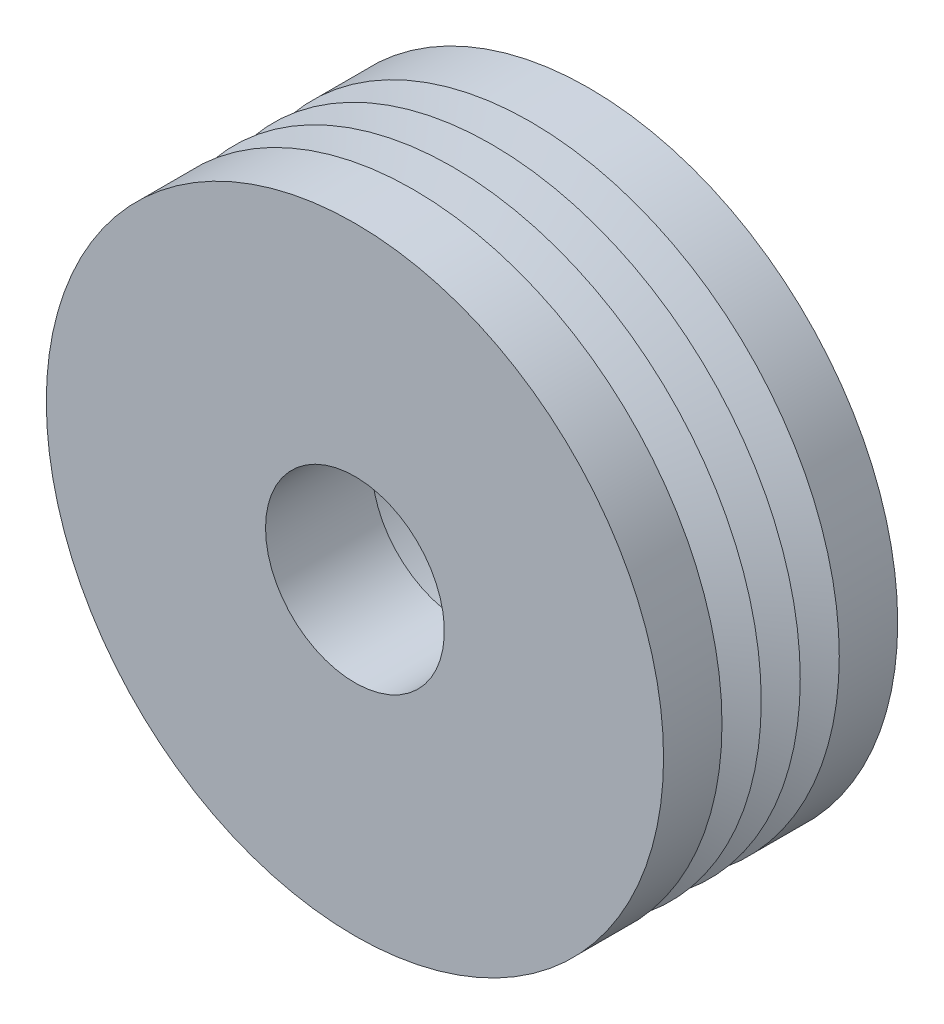
ISO-10303-21;
HEADER;
FILE_DESCRIPTION(('STEP AP214'),'2;1');
FILE_NAME('part.step','',(''),(''),'','','');
FILE_SCHEMA(('AUTOMOTIVE_DESIGN { 1 0 10303 214 1 1 1 1 }'));
ENDSEC;
DATA;
#1=APPLICATION_CONTEXT('core data for automotive mechanical design processes');
#2=APPLICATION_PROTOCOL_DEFINITION('international standard','automotive_design',2000,#1);
#3=PRODUCT_CONTEXT('',#1,'mechanical');
#4=PRODUCT('Part','Part','',(#3));
#5=PRODUCT_RELATED_PRODUCT_CATEGORY('part','',(#4));
#6=PRODUCT_DEFINITION_FORMATION('','',#4);
#7=PRODUCT_DEFINITION_CONTEXT('part definition',#1,'design');
#8=PRODUCT_DEFINITION('design','',#6,#7);
#9=PRODUCT_DEFINITION_SHAPE('','',#8);
#10=(LENGTH_UNIT() NAMED_UNIT(*) SI_UNIT(.MILLI.,.METRE.));
#11=(NAMED_UNIT(*) PLANE_ANGLE_UNIT() SI_UNIT($,.RADIAN.));
#12=(NAMED_UNIT(*) SI_UNIT($,.STERADIAN.) SOLID_ANGLE_UNIT());
#13=UNCERTAINTY_MEASURE_WITH_UNIT(LENGTH_MEASURE(1.E-05),#10,'distance_accuracy_value','');
#14=(GEOMETRIC_REPRESENTATION_CONTEXT(3) GLOBAL_UNCERTAINTY_ASSIGNED_CONTEXT((#13)) GLOBAL_UNIT_ASSIGNED_CONTEXT((#10,
#11,#12)) REPRESENTATION_CONTEXT('',''));
#15=CARTESIAN_POINT('',(0.,0.,0.));
#16=DIRECTION('',(0.,0.,1.));
#17=DIRECTION('',(1.,0.,0.));
#18=AXIS2_PLACEMENT_3D('',#15,#16,#17);
#19=CARTESIAN_POINT('',(0.,0.,-5.5));
#20=DIRECTION('',(0.,0.,-1.));
#21=DIRECTION('',(-1.,0.,0.));
#22=AXIS2_PLACEMENT_3D('',#19,#20,#21);
#23=PLANE('',#22);
#24=CARTESIAN_POINT('',(0.,0.,-5.5));
#25=DIRECTION('',(0.,0.,-1.));
#26=DIRECTION('',(-1.,0.,0.));
#27=AXIS2_PLACEMENT_3D('',#24,#25,#26);
#28=CIRCLE('',#27,4.5);
#29=CARTESIAN_POINT('',(-4.5,0.,-5.5));
#30=VERTEX_POINT('',#29);
#31=EDGE_CURVE('E70',#30,#30,#28,.T.);
#32=ORIENTED_EDGE('',*,*,#31,.F.);
#33=EDGE_LOOP('',(#32));
#34=FACE_BOUND('',#33,.T.);
#35=CARTESIAN_POINT('',(0.,0.,-5.5));
#36=DIRECTION('',(0.,0.,-1.));
#37=DIRECTION('',(-1.,0.,0.));
#38=AXIS2_PLACEMENT_3D('',#35,#36,#37);
#39=CIRCLE('',#38,7.25);
#40=CARTESIAN_POINT('',(-7.25,0.,-5.5));
#41=VERTEX_POINT('',#40);
#42=EDGE_CURVE('E10',#41,#41,#39,.T.);
#43=ORIENTED_EDGE('',*,*,#42,.T.);
#44=EDGE_LOOP('',(#43));
#45=FACE_BOUND('',#44,.T.);
#46=ADVANCED_FACE('F35',(#34,#45),#23,.T.);
#47=CARTESIAN_POINT('',(0.,0.,-5.5));
#48=DIRECTION('',(0.,0.,-1.));
#49=DIRECTION('',(-1.,0.,0.));
#50=AXIS2_PLACEMENT_3D('',#47,#48,#49);
#51=CYLINDRICAL_SURFACE('',#50,7.25);
#52=CARTESIAN_POINT('',(0.,0.,-4.12762455574936));
#53=DIRECTION('',(0.,0.,-1.));
#54=DIRECTION('',(-1.,0.,0.));
#55=AXIS2_PLACEMENT_3D('',#52,#53,#54);
#56=CIRCLE('',#55,7.25);
#57=CARTESIAN_POINT('',(-7.25,0.,-4.12762455574936));
#58=VERTEX_POINT('',#57);
#59=EDGE_CURVE('E41',#58,#58,#56,.T.);
#60=ORIENTED_EDGE('',*,*,#59,.T.);
#61=EDGE_LOOP('',(#60));
#62=FACE_BOUND('',#61,.T.);
#63=ORIENTED_EDGE('',*,*,#42,.F.);
#64=EDGE_LOOP('',(#63));
#65=FACE_BOUND('',#64,.T.);
#66=ADVANCED_FACE('F104',(#62,#65),#51,.T.);
#67=CARTESIAN_POINT('',(0.,0.,-4.12762455574936));
#68=DIRECTION('',(0.,0.,-1.));
#69=DIRECTION('',(-1.,0.,0.));
#70=AXIS2_PLACEMENT_3D('',#67,#68,#69);
#71=CONICAL_SURFACE('',#70,7.25,1.13886727520669);
#72=CARTESIAN_POINT('',(0.,0.,-3.66666666666667));
#73=DIRECTION('',(0.,0.,-1.));
#74=DIRECTION('',(-1.,0.,0.));
#75=AXIS2_PLACEMENT_3D('',#72,#73,#74);
#76=CIRCLE('',#75,6.25);
#77=CARTESIAN_POINT('',(-6.25,0.,-3.66666666666667));
#78=VERTEX_POINT('',#77);
#79=EDGE_CURVE('E45',#78,#78,#76,.T.);
#80=ORIENTED_EDGE('',*,*,#79,.T.);
#81=EDGE_LOOP('',(#80));
#82=FACE_BOUND('',#81,.T.);
#83=ORIENTED_EDGE('',*,*,#59,.F.);
#84=EDGE_LOOP('',(#83));
#85=FACE_BOUND('',#84,.T.);
#86=ADVANCED_FACE('F108',(#82,#85),#71,.T.);
#87=CARTESIAN_POINT('',(0.,0.,-3.66666666666667));
#88=DIRECTION('',(0.,0.,1.));
#89=DIRECTION('',(1.,0.,0.));
#90=AXIS2_PLACEMENT_3D('',#87,#88,#89);
#91=CONICAL_SURFACE('',#90,6.25,1.14320513240904);
#92=CARTESIAN_POINT('',(0.,0.,-3.21095788908269));
#93=DIRECTION('',(0.,0.,-1.));
#94=DIRECTION('',(-1.,0.,0.));
#95=AXIS2_PLACEMENT_3D('',#92,#93,#94);
#96=CIRCLE('',#95,7.25);
#97=CARTESIAN_POINT('',(-7.25,0.,-3.21095788908269));
#98=VERTEX_POINT('',#97);
#99=EDGE_CURVE('E49',#98,#98,#96,.T.);
#100=ORIENTED_EDGE('',*,*,#99,.T.);
#101=EDGE_LOOP('',(#100));
#102=FACE_BOUND('',#101,.T.);
#103=ORIENTED_EDGE('',*,*,#79,.F.);
#104=EDGE_LOOP('',(#103));
#105=FACE_BOUND('',#104,.T.);
#106=ADVANCED_FACE('F112',(#102,#105),#91,.T.);
#107=CARTESIAN_POINT('',(0.,0.,-3.21095788908269));
#108=DIRECTION('',(0.,0.,-1.));
#109=DIRECTION('',(-1.,0.,0.));
#110=AXIS2_PLACEMENT_3D('',#107,#108,#109);
#111=CONICAL_SURFACE('',#110,7.25,1.14320513240904);
#112=CARTESIAN_POINT('',(0.,0.,-2.75524911149872));
#113=DIRECTION('',(0.,0.,-1.));
#114=DIRECTION('',(-1.,0.,0.));
#115=AXIS2_PLACEMENT_3D('',#112,#113,#114);
#116=CIRCLE('',#115,6.25);
#117=CARTESIAN_POINT('',(-6.25,0.,-2.75524911149872));
#118=VERTEX_POINT('',#117);
#119=EDGE_CURVE('E54',#118,#118,#116,.T.);
#120=ORIENTED_EDGE('',*,*,#119,.T.);
#121=EDGE_LOOP('',(#120));
#122=FACE_BOUND('',#121,.T.);
#123=ORIENTED_EDGE('',*,*,#99,.F.);
#124=EDGE_LOOP('',(#123));
#125=FACE_BOUND('',#124,.T.);
#126=ADVANCED_FACE('F119',(#122,#125),#111,.T.);
#127=CARTESIAN_POINT('',(0.,0.,-2.75524911149872));
#128=DIRECTION('',(0.,0.,1.));
#129=DIRECTION('',(1.,0.,0.));
#130=AXIS2_PLACEMENT_3D('',#127,#128,#129);
#131=CONICAL_SURFACE('',#130,6.25,1.13886727520669);
#132=CARTESIAN_POINT('',(0.,0.,-2.29429122241603));
#133=DIRECTION('',(0.,0.,-1.));
#134=DIRECTION('',(-1.,0.,0.));
#135=AXIS2_PLACEMENT_3D('',#132,#133,#134);
#136=CIRCLE('',#135,7.25);
#137=CARTESIAN_POINT('',(-7.25,0.,-2.29429122241603));
#138=VERTEX_POINT('',#137);
#139=EDGE_CURVE('E57',#138,#138,#136,.T.);
#140=ORIENTED_EDGE('',*,*,#139,.T.);
#141=EDGE_LOOP('',(#140));
#142=FACE_BOUND('',#141,.T.);
#143=ORIENTED_EDGE('',*,*,#119,.F.);
#144=EDGE_LOOP('',(#143));
#145=FACE_BOUND('',#144,.T.);
#146=ADVANCED_FACE('F123',(#142,#145),#131,.T.);
#147=CARTESIAN_POINT('',(0.,0.,-2.29429122241603));
#148=DIRECTION('',(0.,0.,-1.));
#149=DIRECTION('',(-1.,0.,0.));
#150=AXIS2_PLACEMENT_3D('',#147,#148,#149);
#151=CONICAL_SURFACE('',#150,7.25,1.13886727520669);
#152=CARTESIAN_POINT('',(0.,0.,-1.83333333333333));
#153=DIRECTION('',(0.,0.,-1.));
#154=DIRECTION('',(-1.,0.,0.));
#155=AXIS2_PLACEMENT_3D('',#152,#153,#154);
#156=CIRCLE('',#155,6.25);
#157=CARTESIAN_POINT('',(-6.25,0.,-1.83333333333333));
#158=VERTEX_POINT('',#157);
#159=EDGE_CURVE('E60',#158,#158,#156,.T.);
#160=ORIENTED_EDGE('',*,*,#159,.T.);
#161=EDGE_LOOP('',(#160));
#162=FACE_BOUND('',#161,.T.);
#163=ORIENTED_EDGE('',*,*,#139,.F.);
#164=EDGE_LOOP('',(#163));
#165=FACE_BOUND('',#164,.T.);
#166=ADVANCED_FACE('F127',(#162,#165),#151,.T.);
#167=CARTESIAN_POINT('',(0.,0.,-1.83333333333333));
#168=DIRECTION('',(0.,0.,1.));
#169=DIRECTION('',(1.,0.,0.));
#170=AXIS2_PLACEMENT_3D('',#167,#168,#169);
#171=CONICAL_SURFACE('',#170,6.25,1.13886727520669);
#172=CARTESIAN_POINT('',(0.,0.,-1.37237544425064));
#173=DIRECTION('',(0.,0.,-1.));
#174=DIRECTION('',(-1.,0.,0.));
#175=AXIS2_PLACEMENT_3D('',#172,#173,#174);
#176=CIRCLE('',#175,7.25);
#177=CARTESIAN_POINT('',(-7.25,0.,-1.37237544425064));
#178=VERTEX_POINT('',#177);
#179=EDGE_CURVE('E63',#178,#178,#176,.T.);
#180=ORIENTED_EDGE('',*,*,#179,.T.);
#181=EDGE_LOOP('',(#180));
#182=FACE_BOUND('',#181,.T.);
#183=ORIENTED_EDGE('',*,*,#159,.F.);
#184=EDGE_LOOP('',(#183));
#185=FACE_BOUND('',#184,.T.);
#186=ADVANCED_FACE('F131',(#182,#185),#171,.T.);
#187=CARTESIAN_POINT('',(0.,0.,-5.5));
#188=DIRECTION('',(0.,0.,-1.));
#189=DIRECTION('',(-1.,0.,0.));
#190=AXIS2_PLACEMENT_3D('',#187,#188,#189);
#191=CYLINDRICAL_SURFACE('',#190,7.25000000001131);
#192=CARTESIAN_POINT('',(0.,0.,0.));
#193=DIRECTION('',(0.,0.,-1.));
#194=DIRECTION('',(-1.,0.,0.));
#195=AXIS2_PLACEMENT_3D('',#192,#193,#194);
#196=CIRCLE('',#195,7.25000000002263);
#197=CARTESIAN_POINT('',(-7.25000000002263,0.,0.));
#198=VERTEX_POINT('',#197);
#199=EDGE_CURVE('E66',#198,#198,#196,.T.);
#200=ORIENTED_EDGE('',*,*,#199,.T.);
#201=EDGE_LOOP('',(#200));
#202=FACE_BOUND('',#201,.T.);
#203=ORIENTED_EDGE('',*,*,#179,.F.);
#204=EDGE_LOOP('',(#203));
#205=FACE_BOUND('',#204,.T.);
#206=ADVANCED_FACE('F135',(#202,#205),#191,.T.);
#207=CARTESIAN_POINT('',(-7.25000000002263,0.,0.));
#208=DIRECTION('',(0.,0.,1.));
#209=DIRECTION('',(1.,0.,0.));
#210=AXIS2_PLACEMENT_3D('',#207,#208,#209);
#211=PLANE('',#210);
#212=CARTESIAN_POINT('',(0.,0.,0.));
#213=DIRECTION('',(0.,0.,-1.));
#214=DIRECTION('',(-1.,0.,0.));
#215=AXIS2_PLACEMENT_3D('',#212,#213,#214);
#216=CIRCLE('',#215,2.1);
#217=CARTESIAN_POINT('',(-2.1,0.,0.));
#218=VERTEX_POINT('',#217);
#219=EDGE_CURVE('E73',#218,#218,#216,.T.);
#220=ORIENTED_EDGE('',*,*,#219,.T.);
#221=EDGE_LOOP('',(#220));
#222=FACE_BOUND('',#221,.T.);
#223=ORIENTED_EDGE('',*,*,#199,.F.);
#224=EDGE_LOOP('',(#223));
#225=FACE_BOUND('',#224,.T.);
#226=ADVANCED_FACE('F82',(#222,#225),#211,.T.);
#227=CARTESIAN_POINT('',(0.,0.,-2.5));
#228=DIRECTION('',(0.,0.,-1.));
#229=DIRECTION('',(-1.,0.,0.));
#230=AXIS2_PLACEMENT_3D('',#227,#228,#229);
#231=CYLINDRICAL_SURFACE('',#230,4.5);
#232=CARTESIAN_POINT('',(0.,0.,-2.5));
#233=DIRECTION('',(0.,0.,-1.));
#234=DIRECTION('',(-1.,0.,0.));
#235=AXIS2_PLACEMENT_3D('',#232,#233,#234);
#236=CIRCLE('',#235,4.5);
#237=CARTESIAN_POINT('',(-4.5,0.,-2.5));
#238=VERTEX_POINT('',#237);
#239=EDGE_CURVE('E69',#238,#238,#236,.T.);
#240=ORIENTED_EDGE('',*,*,#239,.F.);
#241=EDGE_LOOP('',(#240));
#242=FACE_BOUND('',#241,.T.);
#243=ORIENTED_EDGE('',*,*,#31,.T.);
#244=EDGE_LOOP('',(#243));
#245=FACE_BOUND('',#244,.T.);
#246=ADVANCED_FACE('F94',(#242,#245),#231,.F.);
#247=CARTESIAN_POINT('',(0.,0.,-2.5));
#248=DIRECTION('',(0.,0.,-1.));
#249=DIRECTION('',(-1.,0.,0.));
#250=AXIS2_PLACEMENT_3D('',#247,#248,#249);
#251=PLANE('',#250);
#252=CARTESIAN_POINT('',(0.,0.,-2.5));
#253=DIRECTION('',(0.,0.,-1.));
#254=DIRECTION('',(-1.,0.,0.));
#255=AXIS2_PLACEMENT_3D('',#252,#253,#254);
#256=CIRCLE('',#255,2.1);
#257=CARTESIAN_POINT('',(-2.1,0.,-2.5));
#258=VERTEX_POINT('',#257);
#259=EDGE_CURVE('E76',#258,#258,#256,.T.);
#260=ORIENTED_EDGE('',*,*,#259,.F.);
#261=EDGE_LOOP('',(#260));
#262=FACE_BOUND('',#261,.T.);
#263=ORIENTED_EDGE('',*,*,#239,.T.);
#264=EDGE_LOOP('',(#263));
#265=FACE_BOUND('',#264,.T.);
#266=ADVANCED_FACE('F88',(#262,#265),#251,.T.);
#267=CARTESIAN_POINT('',(0.,0.,0.));
#268=DIRECTION('',(0.,0.,-1.));
#269=DIRECTION('',(-1.,0.,0.));
#270=AXIS2_PLACEMENT_3D('',#267,#268,#269);
#271=CYLINDRICAL_SURFACE('',#270,2.1);
#272=ORIENTED_EDGE('',*,*,#219,.F.);
#273=EDGE_LOOP('',(#272));
#274=FACE_BOUND('',#273,.T.);
#275=ORIENTED_EDGE('',*,*,#259,.T.);
#276=EDGE_LOOP('',(#275));
#277=FACE_BOUND('',#276,.T.);
#278=ADVANCED_FACE('F85',(#274,#277),#271,.F.);
#279=CLOSED_SHELL('',(#46,#66,#86,#106,#126,#146,#166,#186,#206,#226,#246,#266,#278));
#280=MANIFOLD_SOLID_BREP('B2',#279);
#281=ADVANCED_BREP_SHAPE_REPRESENTATION('',(#18,#280),#14);
#282=SHAPE_DEFINITION_REPRESENTATION(#9,#281);
ENDSEC;
END-ISO-10303-21;
